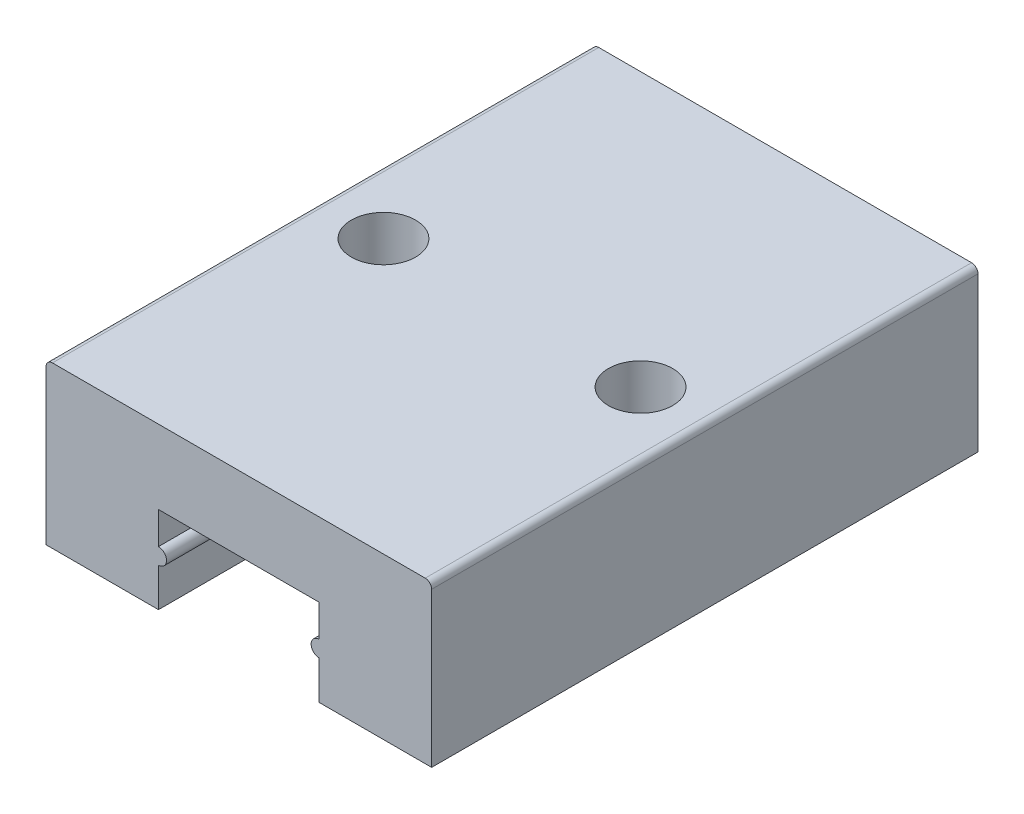
ISO-10303-21;
HEADER;
FILE_DESCRIPTION(('STEP AP214'),'2;1');
FILE_NAME('part.step','',(''),(''),'','','');
FILE_SCHEMA(('AUTOMOTIVE_DESIGN { 1 0 10303 214 1 1 1 1 }'));
ENDSEC;
DATA;
#1=APPLICATION_CONTEXT('core data for automotive mechanical design processes');
#2=APPLICATION_PROTOCOL_DEFINITION('international standard','automotive_design',2000,#1);
#3=PRODUCT_CONTEXT('',#1,'mechanical');
#4=PRODUCT('Part','Part','',(#3));
#5=PRODUCT_RELATED_PRODUCT_CATEGORY('part','',(#4));
#6=PRODUCT_DEFINITION_FORMATION('','',#4);
#7=PRODUCT_DEFINITION_CONTEXT('part definition',#1,'design');
#8=PRODUCT_DEFINITION('design','',#6,#7);
#9=PRODUCT_DEFINITION_SHAPE('','',#8);
#10=(LENGTH_UNIT() NAMED_UNIT(*) SI_UNIT(.MILLI.,.METRE.));
#11=(NAMED_UNIT(*) PLANE_ANGLE_UNIT() SI_UNIT($,.RADIAN.));
#12=(NAMED_UNIT(*) SI_UNIT($,.STERADIAN.) SOLID_ANGLE_UNIT());
#13=UNCERTAINTY_MEASURE_WITH_UNIT(LENGTH_MEASURE(1.E-05),#10,'distance_accuracy_value','');
#14=(GEOMETRIC_REPRESENTATION_CONTEXT(3) GLOBAL_UNCERTAINTY_ASSIGNED_CONTEXT((#13)) GLOBAL_UNIT_ASSIGNED_CONTEXT((#10,
#11,#12)) REPRESENTATION_CONTEXT('',''));
#15=CARTESIAN_POINT('',(0.,0.,0.));
#16=DIRECTION('',(0.,0.,1.));
#17=DIRECTION('',(1.,0.,0.));
#18=AXIS2_PLACEMENT_3D('',#15,#16,#17);
#19=CARTESIAN_POINT('',(2.5,0.,8.5));
#20=DIRECTION('',(1.,0.,0.));
#21=DIRECTION('',(0.,0.,-1.));
#22=AXIS2_PLACEMENT_3D('',#19,#20,#21);
#23=PLANE('',#22);
#24=DIRECTION('',(0.,-1.,0.));
#25=VECTOR('',#24,1.);
#26=CARTESIAN_POINT('',(2.5,0.,-8.5));
#27=LINE('',#26,#25);
#28=CARTESIAN_POINT('',(2.5,1.2,-8.5));
#29=VERTEX_POINT('',#28);
#30=CARTESIAN_POINT('',(2.5,0.,-8.5));
#31=VERTEX_POINT('',#30);
#32=EDGE_CURVE('E161',#29,#31,#27,.T.);
#33=ORIENTED_EDGE('',*,*,#32,.T.);
#34=DIRECTION('',(0.,0.,-1.));
#35=VECTOR('',#34,1.);
#36=CARTESIAN_POINT('',(2.5,0.,8.5));
#37=LINE('',#36,#35);
#38=CARTESIAN_POINT('',(2.5,0.,8.5));
#39=VERTEX_POINT('',#38);
#40=EDGE_CURVE('E144',#39,#31,#37,.T.);
#41=ORIENTED_EDGE('',*,*,#40,.F.);
#42=DIRECTION('',(0.,-1.,0.));
#43=VECTOR('',#42,1.);
#44=CARTESIAN_POINT('',(2.5,0.,8.5));
#45=LINE('',#44,#43);
#46=CARTESIAN_POINT('',(2.5,1.2,8.5));
#47=VERTEX_POINT('',#46);
#48=EDGE_CURVE('E149',#47,#39,#45,.T.);
#49=ORIENTED_EDGE('',*,*,#48,.F.);
#50=DIRECTION('',(0.,0.,-1.));
#51=VECTOR('',#50,1.);
#52=CARTESIAN_POINT('',(2.5,1.2,8.5));
#53=LINE('',#52,#51);
#54=EDGE_CURVE('E217',#47,#29,#53,.T.);
#55=ORIENTED_EDGE('',*,*,#54,.T.);
#56=EDGE_LOOP('',(#33,#41,#49,#55));
#57=FACE_BOUND('',#56,.T.);
#58=ADVANCED_FACE('F36',(#57),#23,.F.);
#59=CARTESIAN_POINT('',(2.5,0.,8.5));
#60=DIRECTION('',(0.,1.,0.));
#61=DIRECTION('',(0.,0.,1.));
#62=AXIS2_PLACEMENT_3D('',#59,#60,#61);
#63=PLANE('',#62);
#64=DIRECTION('',(1.,0.,0.));
#65=VECTOR('',#64,1.);
#66=CARTESIAN_POINT('',(2.5,0.,-8.5));
#67=LINE('',#66,#65);
#68=CARTESIAN_POINT('',(6.,0.,-8.5));
#69=VERTEX_POINT('',#68);
#70=EDGE_CURVE('E196',#31,#69,#67,.T.);
#71=ORIENTED_EDGE('',*,*,#70,.T.);
#72=DIRECTION('',(0.,0.,-1.));
#73=VECTOR('',#72,1.);
#74=CARTESIAN_POINT('',(6.,0.,8.5));
#75=LINE('',#74,#73);
#76=CARTESIAN_POINT('',(6.,0.,8.5));
#77=VERTEX_POINT('',#76);
#78=EDGE_CURVE('E147',#77,#69,#75,.T.);
#79=ORIENTED_EDGE('',*,*,#78,.F.);
#80=DIRECTION('',(1.,0.,0.));
#81=VECTOR('',#80,1.);
#82=CARTESIAN_POINT('',(2.5,0.,8.5));
#83=LINE('',#82,#81);
#84=EDGE_CURVE('E140',#39,#77,#83,.T.);
#85=ORIENTED_EDGE('',*,*,#84,.F.);
#86=ORIENTED_EDGE('',*,*,#40,.T.);
#87=EDGE_LOOP('',(#71,#79,#85,#86));
#88=FACE_BOUND('',#87,.T.);
#89=ADVANCED_FACE('F142',(#88),#63,.F.);
#90=CARTESIAN_POINT('',(6.,0.,8.5));
#91=DIRECTION('',(-1.,0.,0.));
#92=DIRECTION('',(0.,-1.,0.));
#93=AXIS2_PLACEMENT_3D('',#90,#91,#92);
#94=PLANE('',#93);
#95=DIRECTION('',(0.,1.,0.));
#96=VECTOR('',#95,1.);
#97=CARTESIAN_POINT('',(6.,0.,-8.5));
#98=LINE('',#97,#96);
#99=CARTESIAN_POINT('',(6.,4.8,-8.5));
#100=VERTEX_POINT('',#99);
#101=EDGE_CURVE('E193',#69,#100,#98,.T.);
#102=ORIENTED_EDGE('',*,*,#101,.T.);
#103=DIRECTION('',(0.,0.,-1.));
#104=VECTOR('',#103,1.);
#105=CARTESIAN_POINT('',(6.,4.8,8.5));
#106=LINE('',#105,#104);
#107=CARTESIAN_POINT('',(6.,4.8,8.5));
#108=VERTEX_POINT('',#107);
#109=EDGE_CURVE('E59',#100,#108,#106,.F.);
#110=ORIENTED_EDGE('',*,*,#109,.T.);
#111=DIRECTION('',(0.,1.,0.));
#112=VECTOR('',#111,1.);
#113=CARTESIAN_POINT('',(6.,0.,8.5));
#114=LINE('',#113,#112);
#115=EDGE_CURVE('E148',#77,#108,#114,.T.);
#116=ORIENTED_EDGE('',*,*,#115,.F.);
#117=ORIENTED_EDGE('',*,*,#78,.T.);
#118=EDGE_LOOP('',(#102,#110,#116,#117));
#119=FACE_BOUND('',#118,.T.);
#120=ADVANCED_FACE('F195',(#119),#94,.F.);
#121=CARTESIAN_POINT('',(6.,5.,8.5));
#122=DIRECTION('',(0.,-1.,0.));
#123=DIRECTION('',(0.,0.,-1.));
#124=AXIS2_PLACEMENT_3D('',#121,#122,#123);
#125=PLANE('',#124);
#126=CARTESIAN_POINT('',(4.,5.,0.));
#127=DIRECTION('',(0.,1.,0.));
#128=DIRECTION('',(0.,0.,1.));
#129=AXIS2_PLACEMENT_3D('',#126,#127,#128);
#130=CIRCLE('',#129,1.);
#131=CARTESIAN_POINT('',(4.,5.,1.));
#132=VERTEX_POINT('',#131);
#133=EDGE_CURVE('E272',#132,#132,#130,.T.);
#134=ORIENTED_EDGE('',*,*,#133,.F.);
#135=EDGE_LOOP('',(#134));
#136=FACE_BOUND('',#135,.T.);
#137=CARTESIAN_POINT('',(-4.,5.,0.));
#138=DIRECTION('',(0.,1.,0.));
#139=DIRECTION('',(0.,0.,-1.));
#140=AXIS2_PLACEMENT_3D('',#137,#138,#139);
#141=CIRCLE('',#140,1.);
#142=CARTESIAN_POINT('',(-4.,5.,-1.));
#143=VERTEX_POINT('',#142);
#144=EDGE_CURVE('E282',#143,#143,#141,.T.);
#145=ORIENTED_EDGE('',*,*,#144,.F.);
#146=EDGE_LOOP('',(#145));
#147=FACE_BOUND('',#146,.T.);
#148=DIRECTION('',(-1.,0.,0.));
#149=VECTOR('',#148,1.);
#150=CARTESIAN_POINT('',(6.,5.,8.5));
#151=LINE('',#150,#149);
#152=CARTESIAN_POINT('',(5.8,5.,8.5));
#153=VERTEX_POINT('',#152);
#154=CARTESIAN_POINT('',(-5.8,5.,8.5));
#155=VERTEX_POINT('',#154);
#156=EDGE_CURVE('E179',#153,#155,#151,.T.);
#157=ORIENTED_EDGE('',*,*,#156,.F.);
#158=DIRECTION('',(0.,0.,-1.));
#159=VECTOR('',#158,1.);
#160=CARTESIAN_POINT('',(5.8,5.,8.5));
#161=LINE('',#160,#159);
#162=CARTESIAN_POINT('',(5.8,5.,-8.5));
#163=VERTEX_POINT('',#162);
#164=EDGE_CURVE('E164',#153,#163,#161,.T.);
#165=ORIENTED_EDGE('',*,*,#164,.T.);
#166=DIRECTION('',(-1.,0.,0.));
#167=VECTOR('',#166,1.);
#168=CARTESIAN_POINT('',(6.,5.,-8.5));
#169=LINE('',#168,#167);
#170=CARTESIAN_POINT('',(-5.8,5.,-8.5));
#171=VERTEX_POINT('',#170);
#172=EDGE_CURVE('E194',#163,#171,#169,.T.);
#173=ORIENTED_EDGE('',*,*,#172,.T.);
#174=DIRECTION('',(0.,0.,-1.));
#175=VECTOR('',#174,1.);
#176=CARTESIAN_POINT('',(-5.8,5.,8.5));
#177=LINE('',#176,#175);
#178=EDGE_CURVE('E162',#171,#155,#177,.F.);
#179=ORIENTED_EDGE('',*,*,#178,.T.);
#180=EDGE_LOOP('',(#157,#165,#173,#179));
#181=FACE_BOUND('',#180,.T.);
#182=ADVANCED_FACE('F183',(#136,#147,#181),#125,.F.);
#183=CARTESIAN_POINT('',(-6.,0.,8.5));
#184=DIRECTION('',(1.,0.,0.));
#185=DIRECTION('',(0.,1.,0.));
#186=AXIS2_PLACEMENT_3D('',#183,#184,#185);
#187=PLANE('',#186);
#188=DIRECTION('',(0.,-1.,0.));
#189=VECTOR('',#188,1.);
#190=CARTESIAN_POINT('',(-6.,0.,8.5));
#191=LINE('',#190,#189);
#192=CARTESIAN_POINT('',(-6.,4.8,8.5));
#193=VERTEX_POINT('',#192);
#194=CARTESIAN_POINT('',(-6.,0.,8.5));
#195=VERTEX_POINT('',#194);
#196=EDGE_CURVE('E187',#193,#195,#191,.T.);
#197=ORIENTED_EDGE('',*,*,#196,.F.);
#198=DIRECTION('',(0.,0.,-1.));
#199=VECTOR('',#198,1.);
#200=CARTESIAN_POINT('',(-6.,4.8,8.5));
#201=LINE('',#200,#199);
#202=CARTESIAN_POINT('',(-6.,4.8,-8.5));
#203=VERTEX_POINT('',#202);
#204=EDGE_CURVE('E11',#193,#203,#201,.T.);
#205=ORIENTED_EDGE('',*,*,#204,.T.);
#206=DIRECTION('',(0.,-1.,0.));
#207=VECTOR('',#206,1.);
#208=CARTESIAN_POINT('',(-6.,0.,-8.5));
#209=LINE('',#208,#207);
#210=CARTESIAN_POINT('',(-6.,0.,-8.5));
#211=VERTEX_POINT('',#210);
#212=EDGE_CURVE('E198',#203,#211,#209,.T.);
#213=ORIENTED_EDGE('',*,*,#212,.T.);
#214=DIRECTION('',(0.,0.,-1.));
#215=VECTOR('',#214,1.);
#216=CARTESIAN_POINT('',(-6.,0.,8.5));
#217=LINE('',#216,#215);
#218=EDGE_CURVE('E166',#195,#211,#217,.T.);
#219=ORIENTED_EDGE('',*,*,#218,.F.);
#220=EDGE_LOOP('',(#197,#205,#213,#219));
#221=FACE_BOUND('',#220,.T.);
#222=ADVANCED_FACE('F287',(#221),#187,.F.);
#223=CARTESIAN_POINT('',(-2.5,0.,8.5));
#224=DIRECTION('',(0.,1.,0.));
#225=DIRECTION('',(0.,0.,1.));
#226=AXIS2_PLACEMENT_3D('',#223,#224,#225);
#227=PLANE('',#226);
#228=DIRECTION('',(1.,0.,0.));
#229=VECTOR('',#228,1.);
#230=CARTESIAN_POINT('',(-2.5,0.,-8.5));
#231=LINE('',#230,#229);
#232=CARTESIAN_POINT('',(-2.5,0.,-8.5));
#233=VERTEX_POINT('',#232);
#234=EDGE_CURVE('E204',#211,#233,#231,.T.);
#235=ORIENTED_EDGE('',*,*,#234,.T.);
#236=DIRECTION('',(0.,0.,-1.));
#237=VECTOR('',#236,1.);
#238=CARTESIAN_POINT('',(-2.5,0.,8.5));
#239=LINE('',#238,#237);
#240=CARTESIAN_POINT('',(-2.5,0.,8.5));
#241=VERTEX_POINT('',#240);
#242=EDGE_CURVE('E234',#241,#233,#239,.T.);
#243=ORIENTED_EDGE('',*,*,#242,.F.);
#244=DIRECTION('',(1.,0.,0.));
#245=VECTOR('',#244,1.);
#246=CARTESIAN_POINT('',(-2.5,0.,8.5));
#247=LINE('',#246,#245);
#248=EDGE_CURVE('E243',#195,#241,#247,.T.);
#249=ORIENTED_EDGE('',*,*,#248,.F.);
#250=ORIENTED_EDGE('',*,*,#218,.T.);
#251=EDGE_LOOP('',(#235,#243,#249,#250));
#252=FACE_BOUND('',#251,.T.);
#253=ADVANCED_FACE('F241',(#252),#227,.F.);
#254=CARTESIAN_POINT('',(-2.5,0.,8.5));
#255=DIRECTION('',(-1.,0.,0.));
#256=DIRECTION('',(0.,0.,1.));
#257=AXIS2_PLACEMENT_3D('',#254,#255,#256);
#258=PLANE('',#257);
#259=DIRECTION('',(0.,1.,0.));
#260=VECTOR('',#259,1.);
#261=CARTESIAN_POINT('',(-2.5,0.,-8.5));
#262=LINE('',#261,#260);
#263=CARTESIAN_POINT('',(-2.5,1.2,-8.5));
#264=VERTEX_POINT('',#263);
#265=EDGE_CURVE('E206',#233,#264,#262,.T.);
#266=ORIENTED_EDGE('',*,*,#265,.T.);
#267=DIRECTION('',(0.,0.,-1.));
#268=VECTOR('',#267,1.);
#269=CARTESIAN_POINT('',(-2.5,1.2,8.5));
#270=LINE('',#269,#268);
#271=CARTESIAN_POINT('',(-2.5,1.2,8.5));
#272=VERTEX_POINT('',#271);
#273=EDGE_CURVE('E231',#272,#264,#270,.T.);
#274=ORIENTED_EDGE('',*,*,#273,.F.);
#275=DIRECTION('',(0.,1.,0.));
#276=VECTOR('',#275,1.);
#277=CARTESIAN_POINT('',(-2.5,0.,8.5));
#278=LINE('',#277,#276);
#279=EDGE_CURVE('E260',#241,#272,#278,.T.);
#280=ORIENTED_EDGE('',*,*,#279,.F.);
#281=ORIENTED_EDGE('',*,*,#242,.T.);
#282=EDGE_LOOP('',(#266,#274,#280,#281));
#283=FACE_BOUND('',#282,.T.);
#284=ADVANCED_FACE('F251',(#283),#258,.F.);
#285=CARTESIAN_POINT('',(-2.5,1.45,8.5));
#286=DIRECTION('',(0.,0.,-1.));
#287=DIRECTION('',(-1.,0.,0.));
#288=AXIS2_PLACEMENT_3D('',#285,#286,#287);
#289=CYLINDRICAL_SURFACE('',#288,0.25);
#290=CARTESIAN_POINT('',(-2.5,1.45,-8.5));
#291=DIRECTION('',(0.,0.,1.));
#292=DIRECTION('',(-1.,0.,0.));
#293=AXIS2_PLACEMENT_3D('',#290,#291,#292);
#294=CIRCLE('',#293,0.25);
#295=CARTESIAN_POINT('',(-2.5,1.7,-8.5));
#296=VERTEX_POINT('',#295);
#297=EDGE_CURVE('E208',#264,#296,#294,.T.);
#298=ORIENTED_EDGE('',*,*,#297,.T.);
#299=DIRECTION('',(0.,0.,-1.));
#300=VECTOR('',#299,1.);
#301=CARTESIAN_POINT('',(-2.5,1.7,8.5));
#302=LINE('',#301,#300);
#303=CARTESIAN_POINT('',(-2.5,1.7,8.5));
#304=VERTEX_POINT('',#303);
#305=EDGE_CURVE('E228',#304,#296,#302,.T.);
#306=ORIENTED_EDGE('',*,*,#305,.F.);
#307=CARTESIAN_POINT('',(-2.5,1.45,8.5));
#308=DIRECTION('',(0.,0.,1.));
#309=DIRECTION('',(-1.,0.,0.));
#310=AXIS2_PLACEMENT_3D('',#307,#308,#309);
#311=CIRCLE('',#310,0.25);
#312=EDGE_CURVE('E257',#272,#304,#311,.T.);
#313=ORIENTED_EDGE('',*,*,#312,.F.);
#314=ORIENTED_EDGE('',*,*,#273,.T.);
#315=EDGE_LOOP('',(#298,#306,#313,#314));
#316=FACE_BOUND('',#315,.T.);
#317=ADVANCED_FACE('F255',(#316),#289,.T.);
#318=CARTESIAN_POINT('',(-2.5,1.7,8.5));
#319=DIRECTION('',(-1.,0.,0.));
#320=DIRECTION('',(0.,0.,1.));
#321=AXIS2_PLACEMENT_3D('',#318,#319,#320);
#322=PLANE('',#321);
#323=DIRECTION('',(0.,1.,0.));
#324=VECTOR('',#323,1.);
#325=CARTESIAN_POINT('',(-2.5,1.7,-8.5));
#326=LINE('',#325,#324);
#327=CARTESIAN_POINT('',(-2.5,2.7,-8.5));
#328=VERTEX_POINT('',#327);
#329=EDGE_CURVE('E210',#296,#328,#326,.T.);
#330=ORIENTED_EDGE('',*,*,#329,.T.);
#331=DIRECTION('',(0.,0.,-1.));
#332=VECTOR('',#331,1.);
#333=CARTESIAN_POINT('',(-2.5,2.7,8.5));
#334=LINE('',#333,#332);
#335=CARTESIAN_POINT('',(-2.5,2.7,8.5));
#336=VERTEX_POINT('',#335);
#337=EDGE_CURVE('E225',#336,#328,#334,.T.);
#338=ORIENTED_EDGE('',*,*,#337,.F.);
#339=DIRECTION('',(0.,1.,0.));
#340=VECTOR('',#339,1.);
#341=CARTESIAN_POINT('',(-2.5,1.7,8.5));
#342=LINE('',#341,#340);
#343=EDGE_CURVE('E259',#304,#336,#342,.T.);
#344=ORIENTED_EDGE('',*,*,#343,.F.);
#345=ORIENTED_EDGE('',*,*,#305,.T.);
#346=EDGE_LOOP('',(#330,#338,#344,#345));
#347=FACE_BOUND('',#346,.T.);
#348=ADVANCED_FACE('F314',(#347),#322,.F.);
#349=CARTESIAN_POINT('',(2.5,2.7,8.5));
#350=DIRECTION('',(0.,1.,0.));
#351=DIRECTION('',(0.,0.,1.));
#352=AXIS2_PLACEMENT_3D('',#349,#350,#351);
#353=PLANE('',#352);
#354=DIRECTION('',(1.,0.,0.));
#355=VECTOR('',#354,1.);
#356=CARTESIAN_POINT('',(2.5,2.7,-8.5));
#357=LINE('',#356,#355);
#358=CARTESIAN_POINT('',(2.5,2.7,-8.5));
#359=VERTEX_POINT('',#358);
#360=EDGE_CURVE('E212',#328,#359,#357,.T.);
#361=ORIENTED_EDGE('',*,*,#360,.T.);
#362=DIRECTION('',(0.,0.,-1.));
#363=VECTOR('',#362,1.);
#364=CARTESIAN_POINT('',(2.5,2.7,8.5));
#365=LINE('',#364,#363);
#366=CARTESIAN_POINT('',(2.5,2.7,8.5));
#367=VERTEX_POINT('',#366);
#368=EDGE_CURVE('E222',#367,#359,#365,.T.);
#369=ORIENTED_EDGE('',*,*,#368,.F.);
#370=DIRECTION('',(1.,0.,0.));
#371=VECTOR('',#370,1.);
#372=CARTESIAN_POINT('',(2.5,2.7,8.5));
#373=LINE('',#372,#371);
#374=EDGE_CURVE('E262',#336,#367,#373,.T.);
#375=ORIENTED_EDGE('',*,*,#374,.F.);
#376=ORIENTED_EDGE('',*,*,#337,.T.);
#377=EDGE_LOOP('',(#361,#369,#375,#376));
#378=FACE_BOUND('',#377,.T.);
#379=ADVANCED_FACE('F317',(#378),#353,.F.);
#380=CARTESIAN_POINT('',(2.5,1.7,8.5));
#381=DIRECTION('',(1.,0.,0.));
#382=DIRECTION('',(0.,0.,-1.));
#383=AXIS2_PLACEMENT_3D('',#380,#381,#382);
#384=PLANE('',#383);
#385=DIRECTION('',(0.,-1.,0.));
#386=VECTOR('',#385,1.);
#387=CARTESIAN_POINT('',(2.5,1.7,-8.5));
#388=LINE('',#387,#386);
#389=CARTESIAN_POINT('',(2.5,1.7,-8.5));
#390=VERTEX_POINT('',#389);
#391=EDGE_CURVE('E214',#359,#390,#388,.T.);
#392=ORIENTED_EDGE('',*,*,#391,.T.);
#393=DIRECTION('',(0.,0.,-1.));
#394=VECTOR('',#393,1.);
#395=CARTESIAN_POINT('',(2.5,1.7,8.5));
#396=LINE('',#395,#394);
#397=CARTESIAN_POINT('',(2.5,1.7,8.5));
#398=VERTEX_POINT('',#397);
#399=EDGE_CURVE('E219',#398,#390,#396,.T.);
#400=ORIENTED_EDGE('',*,*,#399,.F.);
#401=DIRECTION('',(0.,-1.,0.));
#402=VECTOR('',#401,1.);
#403=CARTESIAN_POINT('',(2.5,1.7,8.5));
#404=LINE('',#403,#402);
#405=EDGE_CURVE('E268',#367,#398,#404,.T.);
#406=ORIENTED_EDGE('',*,*,#405,.F.);
#407=ORIENTED_EDGE('',*,*,#368,.T.);
#408=EDGE_LOOP('',(#392,#400,#406,#407));
#409=FACE_BOUND('',#408,.T.);
#410=ADVANCED_FACE('F321',(#409),#384,.F.);
#411=CARTESIAN_POINT('',(2.5,1.45,8.5));
#412=DIRECTION('',(0.,0.,-1.));
#413=DIRECTION('',(-1.,0.,0.));
#414=AXIS2_PLACEMENT_3D('',#411,#412,#413);
#415=CYLINDRICAL_SURFACE('',#414,0.25);
#416=CARTESIAN_POINT('',(2.5,1.45,-8.5));
#417=DIRECTION('',(0.,0.,1.));
#418=DIRECTION('',(1.,0.,0.));
#419=AXIS2_PLACEMENT_3D('',#416,#417,#418);
#420=CIRCLE('',#419,0.25);
#421=EDGE_CURVE('E158',#390,#29,#420,.T.);
#422=ORIENTED_EDGE('',*,*,#421,.T.);
#423=ORIENTED_EDGE('',*,*,#54,.F.);
#424=CARTESIAN_POINT('',(2.5,1.45,8.5));
#425=DIRECTION('',(0.,0.,1.));
#426=DIRECTION('',(1.,0.,0.));
#427=AXIS2_PLACEMENT_3D('',#424,#425,#426);
#428=CIRCLE('',#427,0.25);
#429=EDGE_CURVE('E154',#398,#47,#428,.T.);
#430=ORIENTED_EDGE('',*,*,#429,.F.);
#431=ORIENTED_EDGE('',*,*,#399,.T.);
#432=EDGE_LOOP('',(#422,#423,#430,#431));
#433=FACE_BOUND('',#432,.T.);
#434=ADVANCED_FACE('F325',(#433),#415,.T.);
#435=CARTESIAN_POINT('',(2.5,1.45,8.5));
#436=DIRECTION('',(0.,0.,1.));
#437=DIRECTION('',(1.,0.,0.));
#438=AXIS2_PLACEMENT_3D('',#435,#436,#437);
#439=PLANE('',#438);
#440=ORIENTED_EDGE('',*,*,#115,.T.);
#441=CARTESIAN_POINT('',(5.8,4.8,8.5));
#442=DIRECTION('',(0.,0.,1.));
#443=DIRECTION('',(1.,0.,0.));
#444=AXIS2_PLACEMENT_3D('',#441,#442,#443);
#445=CIRCLE('',#444,0.2);
#446=EDGE_CURVE('E44',#108,#153,#445,.T.);
#447=ORIENTED_EDGE('',*,*,#446,.T.);
#448=ORIENTED_EDGE('',*,*,#156,.T.);
#449=CARTESIAN_POINT('',(-5.8,4.8,8.5));
#450=DIRECTION('',(0.,0.,1.));
#451=DIRECTION('',(1.,0.,0.));
#452=AXIS2_PLACEMENT_3D('',#449,#450,#451);
#453=CIRCLE('',#452,0.2);
#454=EDGE_CURVE('E51',#155,#193,#453,.T.);
#455=ORIENTED_EDGE('',*,*,#454,.T.);
#456=ORIENTED_EDGE('',*,*,#196,.T.);
#457=ORIENTED_EDGE('',*,*,#248,.T.);
#458=ORIENTED_EDGE('',*,*,#279,.T.);
#459=ORIENTED_EDGE('',*,*,#312,.T.);
#460=ORIENTED_EDGE('',*,*,#343,.T.);
#461=ORIENTED_EDGE('',*,*,#374,.T.);
#462=ORIENTED_EDGE('',*,*,#405,.T.);
#463=ORIENTED_EDGE('',*,*,#429,.T.);
#464=ORIENTED_EDGE('',*,*,#48,.T.);
#465=ORIENTED_EDGE('',*,*,#84,.T.);
#466=EDGE_LOOP('',(#440,#447,#448,#455,#456,#457,#458,#459,#460,#461,#462,#463,#464,#465));
#467=FACE_BOUND('',#466,.T.);
#468=ADVANCED_FACE('F152',(#467),#439,.T.);
#469=CARTESIAN_POINT('',(2.5,1.45,-8.5));
#470=DIRECTION('',(0.,0.,1.));
#471=DIRECTION('',(1.,0.,0.));
#472=AXIS2_PLACEMENT_3D('',#469,#470,#471);
#473=PLANE('',#472);
#474=ORIENTED_EDGE('',*,*,#172,.F.);
#475=CARTESIAN_POINT('',(5.8,4.8,-8.5));
#476=DIRECTION('',(0.,0.,1.));
#477=DIRECTION('',(1.,0.,0.));
#478=AXIS2_PLACEMENT_3D('',#475,#476,#477);
#479=CIRCLE('',#478,0.2);
#480=EDGE_CURVE('E174',#163,#100,#479,.F.);
#481=ORIENTED_EDGE('',*,*,#480,.T.);
#482=ORIENTED_EDGE('',*,*,#101,.F.);
#483=ORIENTED_EDGE('',*,*,#70,.F.);
#484=ORIENTED_EDGE('',*,*,#32,.F.);
#485=ORIENTED_EDGE('',*,*,#421,.F.);
#486=ORIENTED_EDGE('',*,*,#391,.F.);
#487=ORIENTED_EDGE('',*,*,#360,.F.);
#488=ORIENTED_EDGE('',*,*,#329,.F.);
#489=ORIENTED_EDGE('',*,*,#297,.F.);
#490=ORIENTED_EDGE('',*,*,#265,.F.);
#491=ORIENTED_EDGE('',*,*,#234,.F.);
#492=ORIENTED_EDGE('',*,*,#212,.F.);
#493=CARTESIAN_POINT('',(-5.8,4.8,-8.5));
#494=DIRECTION('',(0.,0.,1.));
#495=DIRECTION('',(1.,0.,0.));
#496=AXIS2_PLACEMENT_3D('',#493,#494,#495);
#497=CIRCLE('',#496,0.2);
#498=EDGE_CURVE('E172',#203,#171,#497,.F.);
#499=ORIENTED_EDGE('',*,*,#498,.T.);
#500=EDGE_LOOP('',(#474,#481,#482,#483,#484,#485,#486,#487,#488,#489,#490,#491,#492,#499));
#501=FACE_BOUND('',#500,.T.);
#502=ADVANCED_FACE('F192',(#501),#473,.F.);
#503=CARTESIAN_POINT('',(-4.,3.,0.));
#504=DIRECTION('',(0.,1.,0.));
#505=DIRECTION('',(0.,0.,1.));
#506=AXIS2_PLACEMENT_3D('',#503,#504,#505);
#507=CYLINDRICAL_SURFACE('',#506,1.);
#508=CARTESIAN_POINT('',(-4.,3.,0.));
#509=DIRECTION('',(0.,1.,0.));
#510=DIRECTION('',(0.,0.,-1.));
#511=AXIS2_PLACEMENT_3D('',#508,#509,#510);
#512=CIRCLE('',#511,1.);
#513=CARTESIAN_POINT('',(-4.,3.,-1.));
#514=VERTEX_POINT('',#513);
#515=EDGE_CURVE('E277',#514,#514,#512,.T.);
#516=ORIENTED_EDGE('',*,*,#515,.F.);
#517=EDGE_LOOP('',(#516));
#518=FACE_BOUND('',#517,.T.);
#519=ORIENTED_EDGE('',*,*,#144,.T.);
#520=EDGE_LOOP('',(#519));
#521=FACE_BOUND('',#520,.T.);
#522=ADVANCED_FACE('F332',(#518,#521),#507,.F.);
#523=CARTESIAN_POINT('',(-4.,3.,0.));
#524=DIRECTION('',(0.,-1.,0.));
#525=DIRECTION('',(0.,0.,-1.));
#526=AXIS2_PLACEMENT_3D('',#523,#524,#525);
#527=PLANE('',#526);
#528=ORIENTED_EDGE('',*,*,#515,.T.);
#529=EDGE_LOOP('',(#528));
#530=FACE_BOUND('',#529,.T.);
#531=ADVANCED_FACE('F337',(#530),#527,.F.);
#532=CARTESIAN_POINT('',(4.,3.,0.));
#533=DIRECTION('',(0.,1.,0.));
#534=DIRECTION('',(0.,0.,1.));
#535=AXIS2_PLACEMENT_3D('',#532,#533,#534);
#536=CYLINDRICAL_SURFACE('',#535,1.);
#537=CARTESIAN_POINT('',(4.,3.,0.));
#538=DIRECTION('',(0.,1.,0.));
#539=DIRECTION('',(0.,0.,1.));
#540=AXIS2_PLACEMENT_3D('',#537,#538,#539);
#541=CIRCLE('',#540,1.);
#542=CARTESIAN_POINT('',(4.,3.,1.));
#543=VERTEX_POINT('',#542);
#544=EDGE_CURVE('E270',#543,#543,#541,.T.);
#545=ORIENTED_EDGE('',*,*,#544,.F.);
#546=EDGE_LOOP('',(#545));
#547=FACE_BOUND('',#546,.T.);
#548=ORIENTED_EDGE('',*,*,#133,.T.);
#549=EDGE_LOOP('',(#548));
#550=FACE_BOUND('',#549,.T.);
#551=ADVANCED_FACE('F341',(#547,#550),#536,.F.);
#552=CARTESIAN_POINT('',(4.,3.,0.));
#553=DIRECTION('',(0.,1.,0.));
#554=DIRECTION('',(0.,0.,1.));
#555=AXIS2_PLACEMENT_3D('',#552,#553,#554);
#556=PLANE('',#555);
#557=ORIENTED_EDGE('',*,*,#544,.T.);
#558=EDGE_LOOP('',(#557));
#559=FACE_BOUND('',#558,.T.);
#560=ADVANCED_FACE('F293',(#559),#556,.T.);
#561=CARTESIAN_POINT('',(5.8,4.8,8.5));
#562=DIRECTION('',(0.,0.,-1.));
#563=DIRECTION('',(-1.,0.,0.));
#564=AXIS2_PLACEMENT_3D('',#561,#562,#563);
#565=CYLINDRICAL_SURFACE('',#564,0.2);
#566=ORIENTED_EDGE('',*,*,#446,.F.);
#567=ORIENTED_EDGE('',*,*,#109,.F.);
#568=ORIENTED_EDGE('',*,*,#480,.F.);
#569=ORIENTED_EDGE('',*,*,#164,.F.);
#570=EDGE_LOOP('',(#566,#567,#568,#569));
#571=FACE_BOUND('',#570,.T.);
#572=ADVANCED_FACE('F189',(#571),#565,.T.);
#573=CARTESIAN_POINT('',(-5.8,4.8,8.5));
#574=DIRECTION('',(0.,0.,-1.));
#575=DIRECTION('',(-1.,0.,0.));
#576=AXIS2_PLACEMENT_3D('',#573,#574,#575);
#577=CYLINDRICAL_SURFACE('',#576,0.2);
#578=ORIENTED_EDGE('',*,*,#454,.F.);
#579=ORIENTED_EDGE('',*,*,#178,.F.);
#580=ORIENTED_EDGE('',*,*,#498,.F.);
#581=ORIENTED_EDGE('',*,*,#204,.F.);
#582=EDGE_LOOP('',(#578,#579,#580,#581));
#583=FACE_BOUND('',#582,.T.);
#584=ADVANCED_FACE('F38',(#583),#577,.T.);
#585=CLOSED_SHELL('',(#58,#89,#120,#182,#222,#253,#284,#317,#348,#379,#410,#434,#468,#502,#522,
#531,#551,#560,#572,#584));
#586=MANIFOLD_SOLID_BREP('B2',#585);
#587=ADVANCED_BREP_SHAPE_REPRESENTATION('',(#18,#586),#14);
#588=SHAPE_DEFINITION_REPRESENTATION(#9,#587);
ENDSEC;
END-ISO-10303-21;
